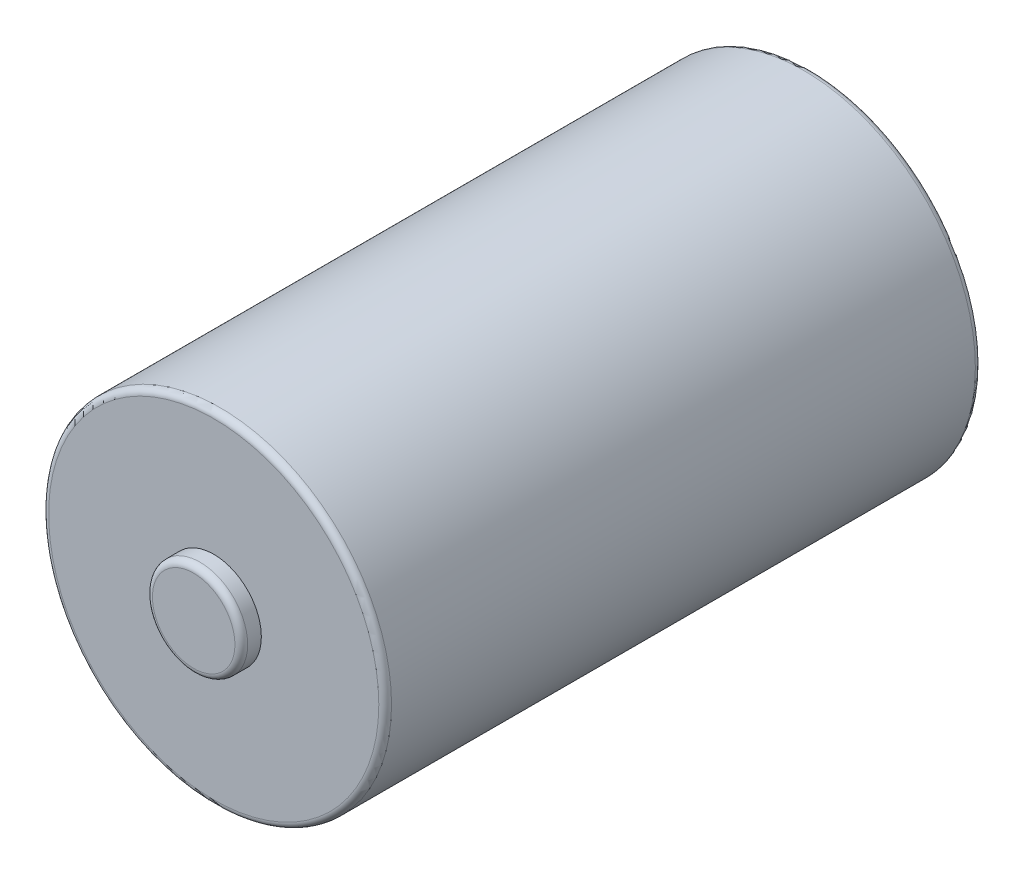
ISO-10303-21;
HEADER;
FILE_DESCRIPTION(('STEP AP214'),'2;1');
FILE_NAME('part.step','',(''),(''),'','','');
FILE_SCHEMA(('AUTOMOTIVE_DESIGN { 1 0 10303 214 1 1 1 1 }'));
ENDSEC;
DATA;
#1=APPLICATION_CONTEXT('core data for automotive mechanical design processes');
#2=APPLICATION_PROTOCOL_DEFINITION('international standard','automotive_design',2000,#1);
#3=PRODUCT_CONTEXT('',#1,'mechanical');
#4=PRODUCT('Part','Part','',(#3));
#5=PRODUCT_RELATED_PRODUCT_CATEGORY('part','',(#4));
#6=PRODUCT_DEFINITION_FORMATION('','',#4);
#7=PRODUCT_DEFINITION_CONTEXT('part definition',#1,'design');
#8=PRODUCT_DEFINITION('design','',#6,#7);
#9=PRODUCT_DEFINITION_SHAPE('','',#8);
#10=(LENGTH_UNIT() NAMED_UNIT(*) SI_UNIT(.MILLI.,.METRE.));
#11=(NAMED_UNIT(*) PLANE_ANGLE_UNIT() SI_UNIT($,.RADIAN.));
#12=(NAMED_UNIT(*) SI_UNIT($,.STERADIAN.) SOLID_ANGLE_UNIT());
#13=UNCERTAINTY_MEASURE_WITH_UNIT(LENGTH_MEASURE(1.E-05),#10,'distance_accuracy_value','');
#14=(GEOMETRIC_REPRESENTATION_CONTEXT(3) GLOBAL_UNCERTAINTY_ASSIGNED_CONTEXT((#13)) GLOBAL_UNIT_ASSIGNED_CONTEXT((#10,
#11,#12)) REPRESENTATION_CONTEXT('',''));
#15=CARTESIAN_POINT('',(0.,0.,0.));
#16=DIRECTION('',(0.,0.,1.));
#17=DIRECTION('',(1.,0.,0.));
#18=AXIS2_PLACEMENT_3D('',#15,#16,#17);
#19=CARTESIAN_POINT('',(0.,0.,59.5));
#20=DIRECTION('',(0.,0.,-1.));
#21=DIRECTION('',(-1.,0.,0.));
#22=AXIS2_PLACEMENT_3D('',#19,#20,#21);
#23=CYLINDRICAL_SURFACE('',#22,17.1);
#24=CARTESIAN_POINT('',(0.,0.,0.634999999999997));
#25=DIRECTION('',(0.,0.,1.));
#26=DIRECTION('',(1.,0.,0.));
#27=AXIS2_PLACEMENT_3D('',#24,#25,#26);
#28=CIRCLE('',#27,17.1);
#29=CARTESIAN_POINT('',(-17.1,0.,0.634999999999997));
#30=VERTEX_POINT('',#29);
#31=EDGE_CURVE('E37',#30,#30,#28,.T.);
#32=CARTESIAN_POINT('',(0.,0.,58.865));
#33=DIRECTION('',(0.,0.,1.));
#34=DIRECTION('',(1.,0.,0.));
#35=AXIS2_PLACEMENT_3D('',#32,#33,#34);
#36=CIRCLE('',#35,17.1);
#37=CARTESIAN_POINT('',(-17.1,0.,58.865));
#38=VERTEX_POINT('',#37);
#39=EDGE_CURVE('E50',#38,#38,#36,.F.);
#40=CARTESIAN_POINT('',(-17.1,0.,0.634999999999997));
#41=CARTESIAN_POINT('',(-17.1,0.,1.2415625));
#42=CARTESIAN_POINT('',(-17.1,0.,1.848125));
#43=CARTESIAN_POINT('',(-17.1,0.,3.06125));
#44=CARTESIAN_POINT('',(-17.1,0.,3.6678125));
#45=CARTESIAN_POINT('',(-17.1,0.,4.8809375));
#46=CARTESIAN_POINT('',(-17.1,0.,5.4875));
#47=CARTESIAN_POINT('',(-17.1,0.,6.700625));
#48=CARTESIAN_POINT('',(-17.1,0.,7.3071875));
#49=CARTESIAN_POINT('',(-17.1,0.,8.5203125));
#50=CARTESIAN_POINT('',(-17.1,0.,9.126875));
#51=CARTESIAN_POINT('',(-17.1,0.,10.34));
#52=CARTESIAN_POINT('',(-17.1,0.,10.9465625));
#53=CARTESIAN_POINT('',(-17.1,0.,12.1596875));
#54=CARTESIAN_POINT('',(-17.1,0.,12.76625));
#55=CARTESIAN_POINT('',(-17.1,0.,13.979375));
#56=CARTESIAN_POINT('',(-17.1,0.,14.5859375));
#57=CARTESIAN_POINT('',(-17.1,0.,15.7990625));
#58=CARTESIAN_POINT('',(-17.1,0.,16.405625));
#59=CARTESIAN_POINT('',(-17.1,0.,17.61875));
#60=CARTESIAN_POINT('',(-17.1,0.,18.2253125));
#61=CARTESIAN_POINT('',(-17.1,0.,19.4384375));
#62=CARTESIAN_POINT('',(-17.1,0.,20.045));
#63=CARTESIAN_POINT('',(-17.1,0.,21.258125));
#64=CARTESIAN_POINT('',(-17.1,0.,21.8646875));
#65=CARTESIAN_POINT('',(-17.1,0.,23.0778125));
#66=CARTESIAN_POINT('',(-17.1,0.,23.684375));
#67=CARTESIAN_POINT('',(-17.1,0.,24.8975));
#68=CARTESIAN_POINT('',(-17.1,0.,25.5040625));
#69=CARTESIAN_POINT('',(-17.1,0.,26.7171875));
#70=CARTESIAN_POINT('',(-17.1,0.,27.32375));
#71=CARTESIAN_POINT('',(-17.1,0.,28.536875));
#72=CARTESIAN_POINT('',(-17.1,0.,29.1434375));
#73=CARTESIAN_POINT('',(-17.1,0.,30.3565625));
#74=CARTESIAN_POINT('',(-17.1,0.,30.963125));
#75=CARTESIAN_POINT('',(-17.1,0.,32.17625));
#76=CARTESIAN_POINT('',(-17.1,0.,32.7828125));
#77=CARTESIAN_POINT('',(-17.1,0.,33.9959375));
#78=CARTESIAN_POINT('',(-17.1,0.,34.6025));
#79=CARTESIAN_POINT('',(-17.1,0.,35.815625));
#80=CARTESIAN_POINT('',(-17.1,0.,36.4221875));
#81=CARTESIAN_POINT('',(-17.1,0.,37.6353125));
#82=CARTESIAN_POINT('',(-17.1,0.,38.241875));
#83=CARTESIAN_POINT('',(-17.1,0.,39.455));
#84=CARTESIAN_POINT('',(-17.1,0.,40.0615625));
#85=CARTESIAN_POINT('',(-17.1,0.,41.2746875));
#86=CARTESIAN_POINT('',(-17.1,0.,41.88125));
#87=CARTESIAN_POINT('',(-17.1,0.,43.094375));
#88=CARTESIAN_POINT('',(-17.1,0.,43.7009375));
#89=CARTESIAN_POINT('',(-17.1,0.,44.9140625));
#90=CARTESIAN_POINT('',(-17.1,0.,45.520625));
#91=CARTESIAN_POINT('',(-17.1,0.,46.73375));
#92=CARTESIAN_POINT('',(-17.1,0.,47.3403125));
#93=CARTESIAN_POINT('',(-17.1,0.,48.5534375));
#94=CARTESIAN_POINT('',(-17.1,0.,49.16));
#95=CARTESIAN_POINT('',(-17.1,0.,50.373125));
#96=CARTESIAN_POINT('',(-17.1,0.,50.9796875));
#97=CARTESIAN_POINT('',(-17.1,0.,52.1928125));
#98=CARTESIAN_POINT('',(-17.1,0.,52.799375));
#99=CARTESIAN_POINT('',(-17.1,0.,54.0125));
#100=CARTESIAN_POINT('',(-17.1,0.,54.6190625));
#101=CARTESIAN_POINT('',(-17.1,0.,55.8321875));
#102=CARTESIAN_POINT('',(-17.1,0.,56.43875));
#103=CARTESIAN_POINT('',(-17.1,0.,57.651875));
#104=CARTESIAN_POINT('',(-17.1,0.,58.2584375));
#105=CARTESIAN_POINT('',(-17.1,0.,58.865));
#106=B_SPLINE_CURVE_WITH_KNOTS('',3,(#40,#41,#42,#43,#44,#45,#46,#47,#48,#49,#50,#51,#52,#53,
#54,#55,#56,#57,#58,#59,#60,#61,#62,#63,#64,#65,#66,#67,#68,#69,#70,#71,#72,#73,#74,#75,#76,#77,
#78,#79,#80,#81,#82,#83,#84,#85,#86,#87,#88,#89,#90,#91,#92,#93,#94,#95,#96,#97,#98,#99,#100,
#101,#102,#103,#104,#105),.UNSPECIFIED.,.F.,.F.,(4,2,2,2,2,2,2,2,2,2,2,2,2,2,2,2,2,2,2,2,2,2,2,
2,2,2,2,2,2,2,2,2,4),(0.,1.8196875,3.639375,5.4590625,7.27875,9.0984375,10.918125,12.7378125,
14.5575,16.3771875,18.196875,20.0165625,21.83625,23.6559375,25.475625,27.2953125,29.115,
30.9346875,32.754375,34.5740625,36.39375,38.2134375,40.033125,41.8528125,43.6725,45.4921875,
47.311875,49.1315625,50.95125,52.7709375,54.590625,56.4103125,58.23),.UNSPECIFIED.);
#107=EDGE_CURVE('BSEAM30',#30,#38,#106,.T.);
#108=ORIENTED_EDGE('',*,*,#31,.T.);
#109=ORIENTED_EDGE('',*,*,#39,.T.);
#110=ORIENTED_EDGE('',*,*,#107,.T.);
#111=ORIENTED_EDGE('',*,*,#107,.F.);
#112=EDGE_LOOP('',(#108,#110,#109,#111));
#113=FACE_BOUND('',#112,.T.);
#114=ADVANCED_FACE('F30',(#113),#23,.T.);
#115=CARTESIAN_POINT('',(0.,0.,59.5));
#116=DIRECTION('',(0.,0.,1.));
#117=DIRECTION('',(1.,0.,0.));
#118=AXIS2_PLACEMENT_3D('',#115,#116,#117);
#119=PLANE('',#118);
#120=CARTESIAN_POINT('',(0.,0.,59.5));
#121=DIRECTION('',(0.,0.,1.));
#122=DIRECTION('',(1.,0.,0.));
#123=AXIS2_PLACEMENT_3D('',#120,#121,#122);
#124=CIRCLE('',#123,16.465);
#125=CARTESIAN_POINT('',(16.465,0.,59.5));
#126=VERTEX_POINT('',#125);
#127=EDGE_CURVE('E53',#126,#126,#124,.T.);
#128=ORIENTED_EDGE('',*,*,#127,.T.);
#129=EDGE_LOOP('',(#128));
#130=FACE_BOUND('',#129,.T.);
#131=CARTESIAN_POINT('',(0.,0.,59.5));
#132=DIRECTION('',(0.,0.,1.));
#133=DIRECTION('',(1.,0.,0.));
#134=AXIS2_PLACEMENT_3D('',#131,#132,#133);
#135=CIRCLE('',#134,4.75);
#136=CARTESIAN_POINT('',(4.75,0.,59.5));
#137=VERTEX_POINT('',#136);
#138=EDGE_CURVE('E56',#137,#137,#135,.T.);
#139=ORIENTED_EDGE('',*,*,#138,.F.);
#140=EDGE_LOOP('',(#139));
#141=FACE_BOUND('',#140,.T.);
#142=ADVANCED_FACE('F62',(#130,#141),#119,.T.);
#143=CARTESIAN_POINT('',(0.,0.,0.));
#144=DIRECTION('',(0.,0.,1.));
#145=DIRECTION('',(1.,0.,0.));
#146=AXIS2_PLACEMENT_3D('',#143,#144,#145);
#147=PLANE('',#146);
#148=CARTESIAN_POINT('',(0.,0.,0.));
#149=DIRECTION('',(0.,0.,1.));
#150=DIRECTION('',(1.,0.,0.));
#151=AXIS2_PLACEMENT_3D('',#148,#149,#150);
#152=CIRCLE('',#151,16.465);
#153=CARTESIAN_POINT('',(16.465,0.,0.));
#154=VERTEX_POINT('',#153);
#155=EDGE_CURVE('E10',#154,#154,#152,.F.);
#156=ORIENTED_EDGE('',*,*,#155,.T.);
#157=EDGE_LOOP('',(#156));
#158=FACE_BOUND('',#157,.T.);
#159=ADVANCED_FACE('F64',(#158),#147,.F.);
#160=CARTESIAN_POINT('',(0.,0.,61.5));
#161=DIRECTION('',(0.,0.,-1.));
#162=DIRECTION('',(-1.,0.,0.));
#163=AXIS2_PLACEMENT_3D('',#160,#161,#162);
#164=CYLINDRICAL_SURFACE('',#163,4.75);
#165=CARTESIAN_POINT('',(0.,0.,60.865));
#166=DIRECTION('',(0.,0.,1.));
#167=DIRECTION('',(1.,0.,0.));
#168=AXIS2_PLACEMENT_3D('',#165,#166,#167);
#169=CIRCLE('',#168,4.75);
#170=CARTESIAN_POINT('',(4.75,0.,60.865));
#171=VERTEX_POINT('',#170);
#172=EDGE_CURVE('E41',#171,#171,#169,.F.);
#173=ORIENTED_EDGE('',*,*,#172,.T.);
#174=EDGE_LOOP('',(#173));
#175=FACE_BOUND('',#174,.T.);
#176=ORIENTED_EDGE('',*,*,#138,.T.);
#177=EDGE_LOOP('',(#176));
#178=FACE_BOUND('',#177,.T.);
#179=ADVANCED_FACE('F60',(#175,#178),#164,.T.);
#180=CARTESIAN_POINT('',(0.,0.,61.5));
#181=DIRECTION('',(0.,0.,1.));
#182=DIRECTION('',(1.,0.,0.));
#183=AXIS2_PLACEMENT_3D('',#180,#181,#182);
#184=PLANE('',#183);
#185=CARTESIAN_POINT('',(0.,0.,61.5));
#186=DIRECTION('',(0.,0.,1.));
#187=DIRECTION('',(1.,0.,0.));
#188=AXIS2_PLACEMENT_3D('',#185,#186,#187);
#189=CIRCLE('',#188,4.115);
#190=CARTESIAN_POINT('',(4.115,0.,61.5));
#191=VERTEX_POINT('',#190);
#192=EDGE_CURVE('E45',#191,#191,#189,.T.);
#193=ORIENTED_EDGE('',*,*,#192,.T.);
#194=EDGE_LOOP('',(#193));
#195=FACE_BOUND('',#194,.T.);
#196=ADVANCED_FACE('F79',(#195),#184,.T.);
#197=CARTESIAN_POINT('',(0.,0.,58.865));
#198=DIRECTION('',(0.,0.,1.));
#199=DIRECTION('',(1.,0.,0.));
#200=AXIS2_PLACEMENT_3D('',#197,#198,#199);
#201=TOROIDAL_SURFACE('',#200,16.465,0.635);
#202=ORIENTED_EDGE('',*,*,#39,.F.);
#203=EDGE_LOOP('',(#202));
#204=FACE_BOUND('',#203,.T.);
#205=ORIENTED_EDGE('',*,*,#127,.F.);
#206=EDGE_LOOP('',(#205));
#207=FACE_BOUND('',#206,.T.);
#208=ADVANCED_FACE('F76',(#204,#207),#201,.T.);
#209=CARTESIAN_POINT('',(0.,0.,60.865));
#210=DIRECTION('',(0.,0.,1.));
#211=DIRECTION('',(1.,0.,0.));
#212=AXIS2_PLACEMENT_3D('',#209,#210,#211);
#213=TOROIDAL_SURFACE('',#212,4.115,0.635);
#214=ORIENTED_EDGE('',*,*,#172,.F.);
#215=EDGE_LOOP('',(#214));
#216=FACE_BOUND('',#215,.T.);
#217=ORIENTED_EDGE('',*,*,#192,.F.);
#218=EDGE_LOOP('',(#217));
#219=FACE_BOUND('',#218,.T.);
#220=ADVANCED_FACE('F78',(#216,#219),#213,.T.);
#221=CARTESIAN_POINT('',(0.,0.,0.634999999999997));
#222=DIRECTION('',(0.,0.,1.));
#223=DIRECTION('',(1.,0.,0.));
#224=AXIS2_PLACEMENT_3D('',#221,#222,#223);
#225=TOROIDAL_SURFACE('',#224,16.465,0.635);
#226=ORIENTED_EDGE('',*,*,#155,.F.);
#227=EDGE_LOOP('',(#226));
#228=FACE_BOUND('',#227,.T.);
#229=ORIENTED_EDGE('',*,*,#31,.F.);
#230=EDGE_LOOP('',(#229));
#231=FACE_BOUND('',#230,.T.);
#232=ADVANCED_FACE('F32',(#228,#231),#225,.T.);
#233=CLOSED_SHELL('',(#114,#142,#159,#179,#196,#208,#220,#232));
#234=MANIFOLD_SOLID_BREP('B2',#233);
#235=ADVANCED_BREP_SHAPE_REPRESENTATION('',(#18,#234),#14);
#236=SHAPE_DEFINITION_REPRESENTATION(#9,#235);
ENDSEC;
END-ISO-10303-21;
